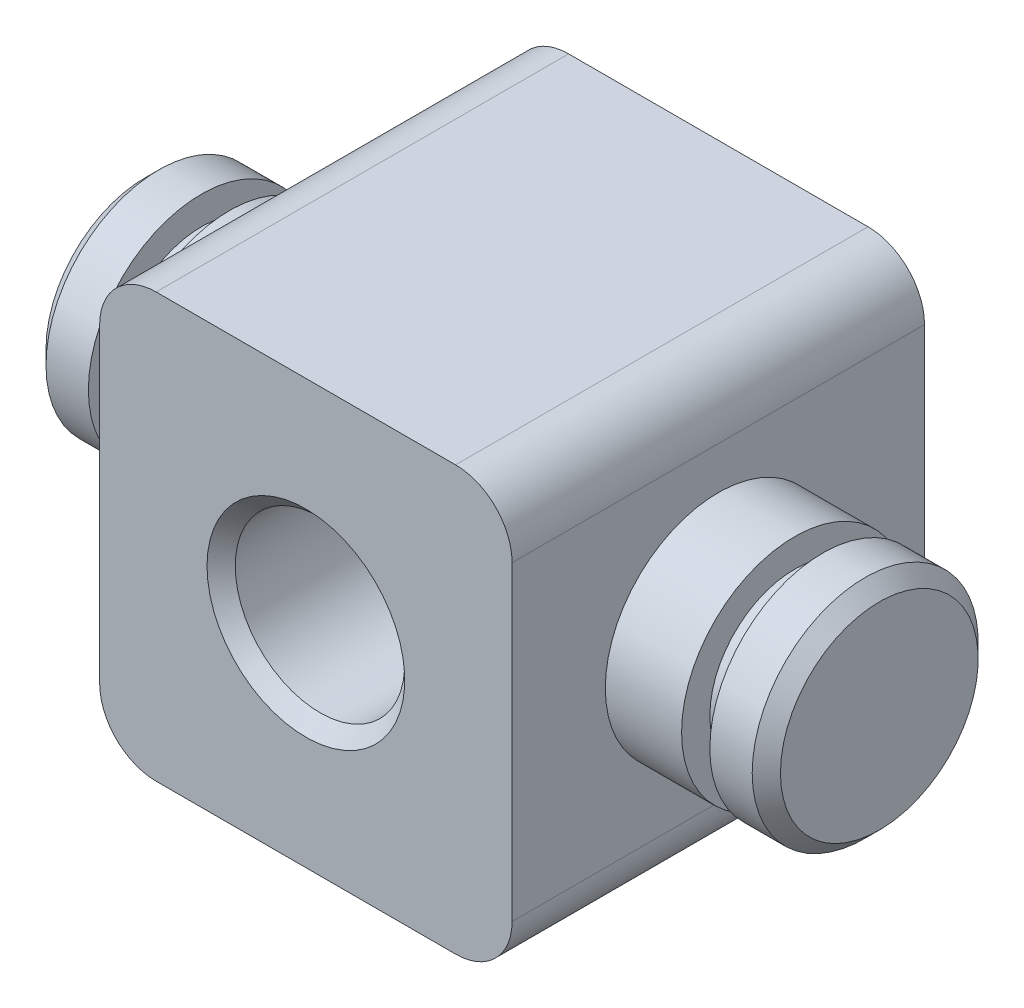
ISO-10303-21;
HEADER;
FILE_DESCRIPTION(('STEP AP214'),'2;1');
FILE_NAME('part.step','',(''),(''),'','','');
FILE_SCHEMA(('AUTOMOTIVE_DESIGN { 1 0 10303 214 1 1 1 1 }'));
ENDSEC;
DATA;
#1=APPLICATION_CONTEXT('core data for automotive mechanical design processes');
#2=APPLICATION_PROTOCOL_DEFINITION('international standard','automotive_design',2000,#1);
#3=PRODUCT_CONTEXT('',#1,'mechanical');
#4=PRODUCT('Part','Part','',(#3));
#5=PRODUCT_RELATED_PRODUCT_CATEGORY('part','',(#4));
#6=PRODUCT_DEFINITION_FORMATION('','',#4);
#7=PRODUCT_DEFINITION_CONTEXT('part definition',#1,'design');
#8=PRODUCT_DEFINITION('design','',#6,#7);
#9=PRODUCT_DEFINITION_SHAPE('','',#8);
#10=(LENGTH_UNIT() NAMED_UNIT(*) SI_UNIT(.MILLI.,.METRE.));
#11=(NAMED_UNIT(*) PLANE_ANGLE_UNIT() SI_UNIT($,.RADIAN.));
#12=(NAMED_UNIT(*) SI_UNIT($,.STERADIAN.) SOLID_ANGLE_UNIT());
#13=UNCERTAINTY_MEASURE_WITH_UNIT(LENGTH_MEASURE(1.E-05),#10,'distance_accuracy_value','');
#14=(GEOMETRIC_REPRESENTATION_CONTEXT(3) GLOBAL_UNCERTAINTY_ASSIGNED_CONTEXT((#13)) GLOBAL_UNIT_ASSIGNED_CONTEXT((#10,
#11,#12)) REPRESENTATION_CONTEXT('',''));
#15=CARTESIAN_POINT('',(0.,0.,0.));
#16=DIRECTION('',(0.,0.,1.));
#17=DIRECTION('',(1.,0.,0.));
#18=AXIS2_PLACEMENT_3D('',#15,#16,#17);
#19=CARTESIAN_POINT('',(5.3,5.5,7.3));
#20=DIRECTION('',(0.,0.,-1.));
#21=DIRECTION('',(-1.,0.,0.));
#22=AXIS2_PLACEMENT_3D('',#19,#20,#21);
#23=PLANE('',#22);
#24=CARTESIAN_POINT('',(0.,0.,7.3));
#25=DIRECTION('',(0.,0.,-1.));
#26=DIRECTION('',(-1.,0.,0.));
#27=AXIS2_PLACEMENT_3D('',#24,#25,#26);
#28=CIRCLE('',#27,3.5);
#29=CARTESIAN_POINT('',(-3.5,0.,7.3));
#30=VERTEX_POINT('',#29);
#31=EDGE_CURVE('E11',#30,#30,#28,.T.);
#32=ORIENTED_EDGE('',*,*,#31,.T.);
#33=EDGE_LOOP('',(#32));
#34=FACE_BOUND('',#33,.T.);
#35=CARTESIAN_POINT('',(5.3,5.5,7.3));
#36=DIRECTION('',(0.,0.,1.));
#37=DIRECTION('',(-1.,0.,0.));
#38=AXIS2_PLACEMENT_3D('',#35,#36,#37);
#39=CIRCLE('',#38,2.);
#40=CARTESIAN_POINT('',(7.3,5.5,7.3));
#41=VERTEX_POINT('',#40);
#42=CARTESIAN_POINT('',(5.3,7.5,7.3));
#43=VERTEX_POINT('',#42);
#44=EDGE_CURVE('E173',#41,#43,#39,.T.);
#45=ORIENTED_EDGE('',*,*,#44,.T.);
#46=DIRECTION('',(-1.,0.,0.));
#47=VECTOR('',#46,1.);
#48=CARTESIAN_POINT('',(-5.3,7.5,7.3));
#49=LINE('',#48,#47);
#50=CARTESIAN_POINT('',(-5.3,7.5,7.3));
#51=VERTEX_POINT('',#50);
#52=EDGE_CURVE('E110',#43,#51,#49,.T.);
#53=ORIENTED_EDGE('',*,*,#52,.T.);
#54=CARTESIAN_POINT('',(-5.3,5.5,7.3));
#55=DIRECTION('',(0.,0.,1.));
#56=DIRECTION('',(1.,0.,0.));
#57=AXIS2_PLACEMENT_3D('',#54,#55,#56);
#58=CIRCLE('',#57,2.);
#59=CARTESIAN_POINT('',(-7.3,5.5,7.3));
#60=VERTEX_POINT('',#59);
#61=EDGE_CURVE('E361',#51,#60,#58,.T.);
#62=ORIENTED_EDGE('',*,*,#61,.T.);
#63=DIRECTION('',(0.,-1.,0.));
#64=VECTOR('',#63,1.);
#65=CARTESIAN_POINT('',(-7.3,5.5,7.3));
#66=LINE('',#65,#64);
#67=CARTESIAN_POINT('',(-7.3,-5.5,7.3));
#68=VERTEX_POINT('',#67);
#69=EDGE_CURVE('E364',#60,#68,#66,.T.);
#70=ORIENTED_EDGE('',*,*,#69,.T.);
#71=CARTESIAN_POINT('',(-5.3,-5.5,7.3));
#72=DIRECTION('',(0.,0.,1.));
#73=DIRECTION('',(1.,0.,0.));
#74=AXIS2_PLACEMENT_3D('',#71,#72,#73);
#75=CIRCLE('',#74,2.);
#76=CARTESIAN_POINT('',(-5.3,-7.5,7.3));
#77=VERTEX_POINT('',#76);
#78=EDGE_CURVE('E128',#68,#77,#75,.T.);
#79=ORIENTED_EDGE('',*,*,#78,.T.);
#80=DIRECTION('',(1.,0.,0.));
#81=VECTOR('',#80,1.);
#82=CARTESIAN_POINT('',(-5.3,-7.5,7.3));
#83=LINE('',#82,#81);
#84=CARTESIAN_POINT('',(5.3,-7.5,7.3));
#85=VERTEX_POINT('',#84);
#86=EDGE_CURVE('E123',#77,#85,#83,.T.);
#87=ORIENTED_EDGE('',*,*,#86,.T.);
#88=CARTESIAN_POINT('',(5.3,-5.5,7.3));
#89=DIRECTION('',(0.,0.,1.));
#90=DIRECTION('',(1.,0.,0.));
#91=AXIS2_PLACEMENT_3D('',#88,#89,#90);
#92=CIRCLE('',#91,2.);
#93=CARTESIAN_POINT('',(7.3,-5.5,7.3));
#94=VERTEX_POINT('',#93);
#95=EDGE_CURVE('E126',#85,#94,#92,.T.);
#96=ORIENTED_EDGE('',*,*,#95,.T.);
#97=DIRECTION('',(0.,1.,0.));
#98=VECTOR('',#97,1.);
#99=CARTESIAN_POINT('',(7.3,5.5,7.3));
#100=LINE('',#99,#98);
#101=EDGE_CURVE('E66',#94,#41,#100,.T.);
#102=ORIENTED_EDGE('',*,*,#101,.T.);
#103=EDGE_LOOP('',(#45,#53,#62,#70,#79,#87,#96,#102));
#104=FACE_BOUND('',#103,.T.);
#105=ADVANCED_FACE('F47',(#34,#104),#23,.F.);
#106=CARTESIAN_POINT('',(5.3,5.5,-7.3));
#107=DIRECTION('',(0.,0.,-1.));
#108=DIRECTION('',(-1.,0.,0.));
#109=AXIS2_PLACEMENT_3D('',#106,#107,#108);
#110=PLANE('',#109);
#111=CARTESIAN_POINT('',(0.,0.,-7.3));
#112=DIRECTION('',(0.,0.,-1.));
#113=DIRECTION('',(-1.,0.,0.));
#114=AXIS2_PLACEMENT_3D('',#111,#112,#113);
#115=CIRCLE('',#114,3.5);
#116=CARTESIAN_POINT('',(-3.5,0.,-7.3));
#117=VERTEX_POINT('',#116);
#118=EDGE_CURVE('E203',#117,#117,#115,.F.);
#119=ORIENTED_EDGE('',*,*,#118,.T.);
#120=EDGE_LOOP('',(#119));
#121=FACE_BOUND('',#120,.T.);
#122=CARTESIAN_POINT('',(5.3,5.5,-7.3));
#123=DIRECTION('',(0.,0.,1.));
#124=DIRECTION('',(-1.,0.,0.));
#125=AXIS2_PLACEMENT_3D('',#122,#123,#124);
#126=CIRCLE('',#125,2.);
#127=CARTESIAN_POINT('',(7.3,5.5,-7.3));
#128=VERTEX_POINT('',#127);
#129=CARTESIAN_POINT('',(5.3,7.5,-7.3));
#130=VERTEX_POINT('',#129);
#131=EDGE_CURVE('E150',#128,#130,#126,.T.);
#132=ORIENTED_EDGE('',*,*,#131,.F.);
#133=DIRECTION('',(0.,1.,0.));
#134=VECTOR('',#133,1.);
#135=CARTESIAN_POINT('',(7.3,5.5,-7.3));
#136=LINE('',#135,#134);
#137=CARTESIAN_POINT('',(7.3,-5.5,-7.3));
#138=VERTEX_POINT('',#137);
#139=EDGE_CURVE('E101',#138,#128,#136,.T.);
#140=ORIENTED_EDGE('',*,*,#139,.F.);
#141=CARTESIAN_POINT('',(5.3,-5.5,-7.3));
#142=DIRECTION('',(0.,0.,1.));
#143=DIRECTION('',(1.,0.,0.));
#144=AXIS2_PLACEMENT_3D('',#141,#142,#143);
#145=CIRCLE('',#144,2.);
#146=CARTESIAN_POINT('',(5.3,-7.5,-7.3));
#147=VERTEX_POINT('',#146);
#148=EDGE_CURVE('E95',#147,#138,#145,.T.);
#149=ORIENTED_EDGE('',*,*,#148,.F.);
#150=DIRECTION('',(1.,0.,0.));
#151=VECTOR('',#150,1.);
#152=CARTESIAN_POINT('',(-5.3,-7.5,-7.3));
#153=LINE('',#152,#151);
#154=CARTESIAN_POINT('',(-5.3,-7.5,-7.3));
#155=VERTEX_POINT('',#154);
#156=EDGE_CURVE('E137',#155,#147,#153,.T.);
#157=ORIENTED_EDGE('',*,*,#156,.F.);
#158=CARTESIAN_POINT('',(-5.3,-5.5,-7.3));
#159=DIRECTION('',(0.,0.,1.));
#160=DIRECTION('',(1.,0.,0.));
#161=AXIS2_PLACEMENT_3D('',#158,#159,#160);
#162=CIRCLE('',#161,2.);
#163=CARTESIAN_POINT('',(-7.3,-5.5,-7.3));
#164=VERTEX_POINT('',#163);
#165=EDGE_CURVE('E164',#164,#155,#162,.T.);
#166=ORIENTED_EDGE('',*,*,#165,.F.);
#167=DIRECTION('',(0.,-1.,0.));
#168=VECTOR('',#167,1.);
#169=CARTESIAN_POINT('',(-7.3,5.5,-7.3));
#170=LINE('',#169,#168);
#171=CARTESIAN_POINT('',(-7.3,5.5,-7.3));
#172=VERTEX_POINT('',#171);
#173=EDGE_CURVE('E161',#172,#164,#170,.T.);
#174=ORIENTED_EDGE('',*,*,#173,.F.);
#175=CARTESIAN_POINT('',(-5.3,5.5,-7.3));
#176=DIRECTION('',(0.,0.,1.));
#177=DIRECTION('',(1.,0.,0.));
#178=AXIS2_PLACEMENT_3D('',#175,#176,#177);
#179=CIRCLE('',#178,2.);
#180=CARTESIAN_POINT('',(-5.3,7.5,-7.3));
#181=VERTEX_POINT('',#180);
#182=EDGE_CURVE('E158',#181,#172,#179,.T.);
#183=ORIENTED_EDGE('',*,*,#182,.F.);
#184=DIRECTION('',(-1.,0.,0.));
#185=VECTOR('',#184,1.);
#186=CARTESIAN_POINT('',(-5.3,7.5,-7.3));
#187=LINE('',#186,#185);
#188=EDGE_CURVE('E154',#130,#181,#187,.T.);
#189=ORIENTED_EDGE('',*,*,#188,.F.);
#190=EDGE_LOOP('',(#132,#140,#149,#157,#166,#174,#183,#189));
#191=FACE_BOUND('',#190,.T.);
#192=ADVANCED_FACE('F223',(#121,#191),#110,.T.);
#193=CARTESIAN_POINT('',(5.3,5.5,7.3));
#194=DIRECTION('',(0.,0.,-1.));
#195=DIRECTION('',(-1.,0.,0.));
#196=AXIS2_PLACEMENT_3D('',#193,#194,#195);
#197=CYLINDRICAL_SURFACE('',#196,2.);
#198=ORIENTED_EDGE('',*,*,#131,.T.);
#199=DIRECTION('',(0.,0.,-1.));
#200=VECTOR('',#199,1.);
#201=CARTESIAN_POINT('',(5.3,7.5,7.3));
#202=LINE('',#201,#200);
#203=EDGE_CURVE('E192',#43,#130,#202,.T.);
#204=ORIENTED_EDGE('',*,*,#203,.F.);
#205=ORIENTED_EDGE('',*,*,#44,.F.);
#206=DIRECTION('',(0.,0.,-1.));
#207=VECTOR('',#206,1.);
#208=CARTESIAN_POINT('',(7.3,5.5,7.3));
#209=LINE('',#208,#207);
#210=EDGE_CURVE('E146',#41,#128,#209,.T.);
#211=ORIENTED_EDGE('',*,*,#210,.T.);
#212=EDGE_LOOP('',(#198,#204,#205,#211));
#213=FACE_BOUND('',#212,.T.);
#214=ADVANCED_FACE('F226',(#213),#197,.T.);
#215=CARTESIAN_POINT('',(-5.3,7.5,7.3));
#216=DIRECTION('',(0.,-1.,0.));
#217=DIRECTION('',(0.,0.,-1.));
#218=AXIS2_PLACEMENT_3D('',#215,#216,#217);
#219=PLANE('',#218);
#220=ORIENTED_EDGE('',*,*,#188,.T.);
#221=DIRECTION('',(0.,0.,-1.));
#222=VECTOR('',#221,1.);
#223=CARTESIAN_POINT('',(-5.3,7.5,7.3));
#224=LINE('',#223,#222);
#225=EDGE_CURVE('E188',#51,#181,#224,.T.);
#226=ORIENTED_EDGE('',*,*,#225,.F.);
#227=ORIENTED_EDGE('',*,*,#52,.F.);
#228=ORIENTED_EDGE('',*,*,#203,.T.);
#229=EDGE_LOOP('',(#220,#226,#227,#228));
#230=FACE_BOUND('',#229,.T.);
#231=ADVANCED_FACE('F379',(#230),#219,.F.);
#232=CARTESIAN_POINT('',(-5.3,5.5,7.3));
#233=DIRECTION('',(0.,0.,-1.));
#234=DIRECTION('',(-1.,0.,0.));
#235=AXIS2_PLACEMENT_3D('',#232,#233,#234);
#236=CYLINDRICAL_SURFACE('',#235,2.);
#237=ORIENTED_EDGE('',*,*,#182,.T.);
#238=DIRECTION('',(0.,0.,-1.));
#239=VECTOR('',#238,1.);
#240=CARTESIAN_POINT('',(-7.3,5.5,7.3));
#241=LINE('',#240,#239);
#242=EDGE_CURVE('E184',#60,#172,#241,.T.);
#243=ORIENTED_EDGE('',*,*,#242,.F.);
#244=ORIENTED_EDGE('',*,*,#61,.F.);
#245=ORIENTED_EDGE('',*,*,#225,.T.);
#246=EDGE_LOOP('',(#237,#243,#244,#245));
#247=FACE_BOUND('',#246,.T.);
#248=ADVANCED_FACE('F378',(#247),#236,.T.);
#249=CARTESIAN_POINT('',(-7.3,5.5,7.3));
#250=DIRECTION('',(1.,0.,0.));
#251=DIRECTION('',(0.,1.,0.));
#252=AXIS2_PLACEMENT_3D('',#249,#250,#251);
#253=PLANE('',#252);
#254=CARTESIAN_POINT('',(-7.3,0.,0.));
#255=DIRECTION('',(1.,0.,0.));
#256=DIRECTION('',(0.,1.,0.));
#257=AXIS2_PLACEMENT_3D('',#254,#255,#256);
#258=CIRCLE('',#257,4.);
#259=CARTESIAN_POINT('',(-7.3,4.,0.));
#260=VERTEX_POINT('',#259);
#261=EDGE_CURVE('E199',#260,#260,#258,.F.);
#262=ORIENTED_EDGE('',*,*,#261,.F.);
#263=EDGE_LOOP('',(#262));
#264=FACE_BOUND('',#263,.T.);
#265=ORIENTED_EDGE('',*,*,#173,.T.);
#266=DIRECTION('',(0.,0.,-1.));
#267=VECTOR('',#266,1.);
#268=CARTESIAN_POINT('',(-7.3,-5.5,7.3));
#269=LINE('',#268,#267);
#270=EDGE_CURVE('E180',#68,#164,#269,.T.);
#271=ORIENTED_EDGE('',*,*,#270,.F.);
#272=ORIENTED_EDGE('',*,*,#69,.F.);
#273=ORIENTED_EDGE('',*,*,#242,.T.);
#274=EDGE_LOOP('',(#265,#271,#272,#273));
#275=FACE_BOUND('',#274,.T.);
#276=ADVANCED_FACE('F372',(#264,#275),#253,.F.);
#277=CARTESIAN_POINT('',(-5.3,-5.5,7.3));
#278=DIRECTION('',(0.,0.,-1.));
#279=DIRECTION('',(-1.,0.,0.));
#280=AXIS2_PLACEMENT_3D('',#277,#278,#279);
#281=CYLINDRICAL_SURFACE('',#280,2.);
#282=ORIENTED_EDGE('',*,*,#165,.T.);
#283=DIRECTION('',(0.,0.,-1.));
#284=VECTOR('',#283,1.);
#285=CARTESIAN_POINT('',(-5.3,-7.5,7.3));
#286=LINE('',#285,#284);
#287=EDGE_CURVE('E139',#77,#155,#286,.T.);
#288=ORIENTED_EDGE('',*,*,#287,.F.);
#289=ORIENTED_EDGE('',*,*,#78,.F.);
#290=ORIENTED_EDGE('',*,*,#270,.T.);
#291=EDGE_LOOP('',(#282,#288,#289,#290));
#292=FACE_BOUND('',#291,.T.);
#293=ADVANCED_FACE('F376',(#292),#281,.T.);
#294=CARTESIAN_POINT('',(-5.3,-7.5,7.3));
#295=DIRECTION('',(0.,1.,0.));
#296=DIRECTION('',(0.,0.,1.));
#297=AXIS2_PLACEMENT_3D('',#294,#295,#296);
#298=PLANE('',#297);
#299=ORIENTED_EDGE('',*,*,#156,.T.);
#300=DIRECTION('',(0.,0.,-1.));
#301=VECTOR('',#300,1.);
#302=CARTESIAN_POINT('',(5.3,-7.5,7.3));
#303=LINE('',#302,#301);
#304=EDGE_CURVE('E134',#85,#147,#303,.T.);
#305=ORIENTED_EDGE('',*,*,#304,.F.);
#306=ORIENTED_EDGE('',*,*,#86,.F.);
#307=ORIENTED_EDGE('',*,*,#287,.T.);
#308=EDGE_LOOP('',(#299,#305,#306,#307));
#309=FACE_BOUND('',#308,.T.);
#310=ADVANCED_FACE('F135',(#309),#298,.F.);
#311=CARTESIAN_POINT('',(5.3,-5.5,7.3));
#312=DIRECTION('',(0.,0.,-1.));
#313=DIRECTION('',(-1.,0.,0.));
#314=AXIS2_PLACEMENT_3D('',#311,#312,#313);
#315=CYLINDRICAL_SURFACE('',#314,2.);
#316=ORIENTED_EDGE('',*,*,#148,.T.);
#317=DIRECTION('',(0.,0.,-1.));
#318=VECTOR('',#317,1.);
#319=CARTESIAN_POINT('',(7.3,-5.5,7.3));
#320=LINE('',#319,#318);
#321=EDGE_CURVE('E140',#94,#138,#320,.T.);
#322=ORIENTED_EDGE('',*,*,#321,.F.);
#323=ORIENTED_EDGE('',*,*,#95,.F.);
#324=ORIENTED_EDGE('',*,*,#304,.T.);
#325=EDGE_LOOP('',(#316,#322,#323,#324));
#326=FACE_BOUND('',#325,.T.);
#327=ADVANCED_FACE('F142',(#326),#315,.T.);
#328=CARTESIAN_POINT('',(7.3,5.5,7.3));
#329=DIRECTION('',(-1.,0.,0.));
#330=DIRECTION('',(0.,-1.,0.));
#331=AXIS2_PLACEMENT_3D('',#328,#329,#330);
#332=PLANE('',#331);
#333=CARTESIAN_POINT('',(7.3,0.,0.));
#334=DIRECTION('',(-1.,0.,0.));
#335=DIRECTION('',(0.,-1.,0.));
#336=AXIS2_PLACEMENT_3D('',#333,#334,#335);
#337=CIRCLE('',#336,4.);
#338=CARTESIAN_POINT('',(7.3,-4.,0.));
#339=VERTEX_POINT('',#338);
#340=EDGE_CURVE('E195',#339,#339,#337,.F.);
#341=ORIENTED_EDGE('',*,*,#340,.F.);
#342=EDGE_LOOP('',(#341));
#343=FACE_BOUND('',#342,.T.);
#344=ORIENTED_EDGE('',*,*,#139,.T.);
#345=ORIENTED_EDGE('',*,*,#210,.F.);
#346=ORIENTED_EDGE('',*,*,#101,.F.);
#347=ORIENTED_EDGE('',*,*,#321,.T.);
#348=EDGE_LOOP('',(#344,#345,#346,#347));
#349=FACE_BOUND('',#348,.T.);
#350=ADVANCED_FACE('F233',(#343,#349),#332,.F.);
#351=CARTESIAN_POINT('',(0.,0.,7.3));
#352=DIRECTION('',(0.,0.,-1.));
#353=DIRECTION('',(-1.,0.,0.));
#354=AXIS2_PLACEMENT_3D('',#351,#352,#353);
#355=CYLINDRICAL_SURFACE('',#354,3.);
#356=CARTESIAN_POINT('',(0.,0.,-6.8));
#357=DIRECTION('',(0.,0.,-1.));
#358=DIRECTION('',(-1.,0.,0.));
#359=AXIS2_PLACEMENT_3D('',#356,#357,#358);
#360=CIRCLE('',#359,3.);
#361=CARTESIAN_POINT('',(-3.,0.,-6.8));
#362=VERTEX_POINT('',#361);
#363=EDGE_CURVE('E58',#362,#362,#360,.T.);
#364=ORIENTED_EDGE('',*,*,#363,.T.);
#365=EDGE_LOOP('',(#364));
#366=FACE_BOUND('',#365,.T.);
#367=CARTESIAN_POINT('',(0.,0.,6.8));
#368=DIRECTION('',(0.,0.,-1.));
#369=DIRECTION('',(-1.,0.,0.));
#370=AXIS2_PLACEMENT_3D('',#367,#368,#369);
#371=CIRCLE('',#370,3.);
#372=CARTESIAN_POINT('',(-3.,0.,6.8));
#373=VERTEX_POINT('',#372);
#374=EDGE_CURVE('E207',#373,#373,#371,.F.);
#375=ORIENTED_EDGE('',*,*,#374,.T.);
#376=EDGE_LOOP('',(#375));
#377=FACE_BOUND('',#376,.T.);
#378=ADVANCED_FACE('F214',(#366,#377),#355,.F.);
#379=CARTESIAN_POINT('',(-27.281048221811,0.,0.));
#380=DIRECTION('',(-1.,0.,0.));
#381=DIRECTION('',(0.,0.,1.));
#382=AXIS2_PLACEMENT_3D('',#379,#380,#381);
#383=CYLINDRICAL_SURFACE('',#382,4.);
#384=ORIENTED_EDGE('',*,*,#340,.T.);
#385=EDGE_LOOP('',(#384));
#386=FACE_BOUND('',#385,.T.);
#387=CARTESIAN_POINT('',(10.,0.,0.));
#388=DIRECTION('',(-1.,0.,0.));
#389=DIRECTION('',(0.,0.,1.));
#390=AXIS2_PLACEMENT_3D('',#387,#388,#389);
#391=CIRCLE('',#390,4.);
#392=CARTESIAN_POINT('',(10.,0.,4.));
#393=VERTEX_POINT('',#392);
#394=EDGE_CURVE('E155',#393,#393,#391,.T.);
#395=ORIENTED_EDGE('',*,*,#394,.T.);
#396=EDGE_LOOP('',(#395));
#397=FACE_BOUND('',#396,.T.);
#398=ADVANCED_FACE('F242',(#386,#397),#383,.T.);
#399=CARTESIAN_POINT('',(10.,4.,0.));
#400=DIRECTION('',(-1.,0.,0.));
#401=DIRECTION('',(0.,0.,1.));
#402=AXIS2_PLACEMENT_3D('',#399,#400,#401);
#403=PLANE('',#402);
#404=ORIENTED_EDGE('',*,*,#394,.F.);
#405=EDGE_LOOP('',(#404));
#406=FACE_BOUND('',#405,.T.);
#407=CARTESIAN_POINT('',(10.,0.,0.));
#408=DIRECTION('',(-1.,0.,0.));
#409=DIRECTION('',(0.,0.,1.));
#410=AXIS2_PLACEMENT_3D('',#407,#408,#409);
#411=CIRCLE('',#410,3.);
#412=CARTESIAN_POINT('',(10.,0.,3.));
#413=VERTEX_POINT('',#412);
#414=EDGE_CURVE('E331',#413,#413,#411,.T.);
#415=ORIENTED_EDGE('',*,*,#414,.T.);
#416=EDGE_LOOP('',(#415));
#417=FACE_BOUND('',#416,.T.);
#418=ADVANCED_FACE('F282',(#406,#417),#403,.F.);
#419=CARTESIAN_POINT('',(-27.281048221811,0.,0.));
#420=DIRECTION('',(-1.,0.,0.));
#421=DIRECTION('',(0.,0.,1.));
#422=AXIS2_PLACEMENT_3D('',#419,#420,#421);
#423=CYLINDRICAL_SURFACE('',#422,3.);
#424=ORIENTED_EDGE('',*,*,#414,.F.);
#425=EDGE_LOOP('',(#424));
#426=FACE_BOUND('',#425,.T.);
#427=CARTESIAN_POINT('',(11.,0.,0.));
#428=DIRECTION('',(-1.,0.,0.));
#429=DIRECTION('',(0.,0.,1.));
#430=AXIS2_PLACEMENT_3D('',#427,#428,#429);
#431=CIRCLE('',#430,3.);
#432=CARTESIAN_POINT('',(11.,0.,3.));
#433=VERTEX_POINT('',#432);
#434=EDGE_CURVE('E327',#433,#433,#431,.T.);
#435=ORIENTED_EDGE('',*,*,#434,.T.);
#436=EDGE_LOOP('',(#435));
#437=FACE_BOUND('',#436,.T.);
#438=ADVANCED_FACE('F286',(#426,#437),#423,.T.);
#439=CARTESIAN_POINT('',(11.,3.,0.));
#440=DIRECTION('',(1.,0.,0.));
#441=DIRECTION('',(0.,0.,-1.));
#442=AXIS2_PLACEMENT_3D('',#439,#440,#441);
#443=PLANE('',#442);
#444=ORIENTED_EDGE('',*,*,#434,.F.);
#445=EDGE_LOOP('',(#444));
#446=FACE_BOUND('',#445,.T.);
#447=CARTESIAN_POINT('',(11.,0.,0.));
#448=DIRECTION('',(-1.,0.,0.));
#449=DIRECTION('',(0.,0.,1.));
#450=AXIS2_PLACEMENT_3D('',#447,#448,#449);
#451=CIRCLE('',#450,4.);
#452=CARTESIAN_POINT('',(11.,0.,4.));
#453=VERTEX_POINT('',#452);
#454=EDGE_CURVE('E318',#453,#453,#451,.T.);
#455=ORIENTED_EDGE('',*,*,#454,.T.);
#456=EDGE_LOOP('',(#455));
#457=FACE_BOUND('',#456,.T.);
#458=ADVANCED_FACE('F290',(#446,#457),#443,.F.);
#459=CARTESIAN_POINT('',(-27.281048221811,0.,0.));
#460=DIRECTION('',(-1.,0.,0.));
#461=DIRECTION('',(0.,0.,1.));
#462=AXIS2_PLACEMENT_3D('',#459,#460,#461);
#463=CYLINDRICAL_SURFACE('',#462,4.);
#464=ORIENTED_EDGE('',*,*,#454,.F.);
#465=EDGE_LOOP('',(#464));
#466=FACE_BOUND('',#465,.T.);
#467=CARTESIAN_POINT('',(12.5,0.,0.));
#468=DIRECTION('',(-1.,0.,0.));
#469=DIRECTION('',(0.,0.,1.));
#470=AXIS2_PLACEMENT_3D('',#467,#468,#469);
#471=CIRCLE('',#470,4.);
#472=CARTESIAN_POINT('',(12.5,0.,4.));
#473=VERTEX_POINT('',#472);
#474=EDGE_CURVE('E312',#473,#473,#471,.T.);
#475=ORIENTED_EDGE('',*,*,#474,.T.);
#476=EDGE_LOOP('',(#475));
#477=FACE_BOUND('',#476,.T.);
#478=ADVANCED_FACE('F294',(#466,#477),#463,.T.);
#479=CARTESIAN_POINT('',(13.,0.,0.));
#480=DIRECTION('',(-1.,0.,0.));
#481=DIRECTION('',(0.,0.,1.));
#482=AXIS2_PLACEMENT_3D('',#479,#480,#481);
#483=CONICAL_SURFACE('',#482,3.5,0.785398163397447);
#484=ORIENTED_EDGE('',*,*,#474,.F.);
#485=EDGE_LOOP('',(#484));
#486=FACE_BOUND('',#485,.T.);
#487=CARTESIAN_POINT('',(13.,0.,0.));
#488=DIRECTION('',(-1.,0.,0.));
#489=DIRECTION('',(0.,0.,1.));
#490=AXIS2_PLACEMENT_3D('',#487,#488,#489);
#491=CIRCLE('',#490,3.5);
#492=CARTESIAN_POINT('',(13.,0.,3.5));
#493=VERTEX_POINT('',#492);
#494=EDGE_CURVE('E309',#493,#493,#491,.T.);
#495=ORIENTED_EDGE('',*,*,#494,.T.);
#496=EDGE_LOOP('',(#495));
#497=FACE_BOUND('',#496,.T.);
#498=ADVANCED_FACE('F298',(#486,#497),#483,.T.);
#499=CARTESIAN_POINT('',(13.,3.5,0.));
#500=DIRECTION('',(-1.,0.,0.));
#501=DIRECTION('',(0.,0.,1.));
#502=AXIS2_PLACEMENT_3D('',#499,#500,#501);
#503=PLANE('',#502);
#504=ORIENTED_EDGE('',*,*,#494,.F.);
#505=EDGE_LOOP('',(#504));
#506=FACE_BOUND('',#505,.T.);
#507=ADVANCED_FACE('F258',(#506),#503,.F.);
#508=CARTESIAN_POINT('',(-27.281048221811,0.,0.));
#509=DIRECTION('',(-1.,0.,0.));
#510=DIRECTION('',(0.,0.,1.));
#511=AXIS2_PLACEMENT_3D('',#508,#509,#510);
#512=CYLINDRICAL_SURFACE('',#511,4.);
#513=CARTESIAN_POINT('',(-12.5,0.,0.));
#514=DIRECTION('',(-1.,0.,0.));
#515=DIRECTION('',(0.,0.,1.));
#516=AXIS2_PLACEMENT_3D('',#513,#514,#515);
#517=CIRCLE('',#516,4.);
#518=CARTESIAN_POINT('',(-12.5,0.,4.));
#519=VERTEX_POINT('',#518);
#520=EDGE_CURVE('E313',#519,#519,#517,.T.);
#521=ORIENTED_EDGE('',*,*,#520,.F.);
#522=EDGE_LOOP('',(#521));
#523=FACE_BOUND('',#522,.T.);
#524=CARTESIAN_POINT('',(-11.,0.,0.));
#525=DIRECTION('',(-1.,0.,0.));
#526=DIRECTION('',(0.,0.,1.));
#527=AXIS2_PLACEMENT_3D('',#524,#525,#526);
#528=CIRCLE('',#527,4.);
#529=CARTESIAN_POINT('',(-11.,0.,4.));
#530=VERTEX_POINT('',#529);
#531=EDGE_CURVE('E338',#530,#530,#528,.T.);
#532=ORIENTED_EDGE('',*,*,#531,.T.);
#533=EDGE_LOOP('',(#532));
#534=FACE_BOUND('',#533,.T.);
#535=ADVANCED_FACE('F254',(#523,#534),#512,.T.);
#536=CARTESIAN_POINT('',(-12.5,0.,0.));
#537=DIRECTION('',(1.,0.,0.));
#538=DIRECTION('',(0.,0.,-1.));
#539=AXIS2_PLACEMENT_3D('',#536,#537,#538);
#540=CONICAL_SURFACE('',#539,4.,0.785398163397447);
#541=CARTESIAN_POINT('',(-13.,0.,0.));
#542=DIRECTION('',(-1.,0.,0.));
#543=DIRECTION('',(0.,0.,1.));
#544=AXIS2_PLACEMENT_3D('',#541,#542,#543);
#545=CIRCLE('',#544,3.5);
#546=CARTESIAN_POINT('',(-13.,0.,3.5));
#547=VERTEX_POINT('',#546);
#548=EDGE_CURVE('E321',#547,#547,#545,.T.);
#549=ORIENTED_EDGE('',*,*,#548,.F.);
#550=EDGE_LOOP('',(#549));
#551=FACE_BOUND('',#550,.T.);
#552=ORIENTED_EDGE('',*,*,#520,.T.);
#553=EDGE_LOOP('',(#552));
#554=FACE_BOUND('',#553,.T.);
#555=ADVANCED_FACE('F257',(#551,#554),#540,.T.);
#556=CARTESIAN_POINT('',(-13.,3.5,0.));
#557=DIRECTION('',(1.,0.,0.));
#558=DIRECTION('',(0.,0.,-1.));
#559=AXIS2_PLACEMENT_3D('',#556,#557,#558);
#560=PLANE('',#559);
#561=ORIENTED_EDGE('',*,*,#548,.T.);
#562=EDGE_LOOP('',(#561));
#563=FACE_BOUND('',#562,.T.);
#564=ADVANCED_FACE('F262',(#563),#560,.F.);
#565=CARTESIAN_POINT('',(-27.281048221811,0.,0.));
#566=DIRECTION('',(-1.,0.,0.));
#567=DIRECTION('',(0.,0.,1.));
#568=AXIS2_PLACEMENT_3D('',#565,#566,#567);
#569=CYLINDRICAL_SURFACE('',#568,4.);
#570=CARTESIAN_POINT('',(-10.,0.,0.));
#571=DIRECTION('',(-1.,0.,0.));
#572=DIRECTION('',(0.,0.,1.));
#573=AXIS2_PLACEMENT_3D('',#570,#571,#572);
#574=CIRCLE('',#573,4.);
#575=CARTESIAN_POINT('',(-10.,0.,4.));
#576=VERTEX_POINT('',#575);
#577=EDGE_CURVE('E350',#576,#576,#574,.T.);
#578=ORIENTED_EDGE('',*,*,#577,.F.);
#579=EDGE_LOOP('',(#578));
#580=FACE_BOUND('',#579,.T.);
#581=ORIENTED_EDGE('',*,*,#261,.T.);
#582=EDGE_LOOP('',(#581));
#583=FACE_BOUND('',#582,.T.);
#584=ADVANCED_FACE('F266',(#580,#583),#569,.T.);
#585=CARTESIAN_POINT('',(-10.,4.,0.));
#586=DIRECTION('',(1.,0.,0.));
#587=DIRECTION('',(0.,0.,-1.));
#588=AXIS2_PLACEMENT_3D('',#585,#586,#587);
#589=PLANE('',#588);
#590=CARTESIAN_POINT('',(-10.,0.,0.));
#591=DIRECTION('',(-1.,0.,0.));
#592=DIRECTION('',(0.,0.,1.));
#593=AXIS2_PLACEMENT_3D('',#590,#591,#592);
#594=CIRCLE('',#593,3.);
#595=CARTESIAN_POINT('',(-10.,0.,3.));
#596=VERTEX_POINT('',#595);
#597=EDGE_CURVE('E346',#596,#596,#594,.T.);
#598=ORIENTED_EDGE('',*,*,#597,.F.);
#599=EDGE_LOOP('',(#598));
#600=FACE_BOUND('',#599,.T.);
#601=ORIENTED_EDGE('',*,*,#577,.T.);
#602=EDGE_LOOP('',(#601));
#603=FACE_BOUND('',#602,.T.);
#604=ADVANCED_FACE('F270',(#600,#603),#589,.F.);
#605=CARTESIAN_POINT('',(-27.281048221811,0.,0.));
#606=DIRECTION('',(-1.,0.,0.));
#607=DIRECTION('',(0.,0.,1.));
#608=AXIS2_PLACEMENT_3D('',#605,#606,#607);
#609=CYLINDRICAL_SURFACE('',#608,3.);
#610=CARTESIAN_POINT('',(-11.,0.,0.));
#611=DIRECTION('',(-1.,0.,0.));
#612=DIRECTION('',(0.,0.,1.));
#613=AXIS2_PLACEMENT_3D('',#610,#611,#612);
#614=CIRCLE('',#613,3.);
#615=CARTESIAN_POINT('',(-11.,0.,3.));
#616=VERTEX_POINT('',#615);
#617=EDGE_CURVE('E342',#616,#616,#614,.T.);
#618=ORIENTED_EDGE('',*,*,#617,.F.);
#619=EDGE_LOOP('',(#618));
#620=FACE_BOUND('',#619,.T.);
#621=ORIENTED_EDGE('',*,*,#597,.T.);
#622=EDGE_LOOP('',(#621));
#623=FACE_BOUND('',#622,.T.);
#624=ADVANCED_FACE('F274',(#620,#623),#609,.T.);
#625=CARTESIAN_POINT('',(-11.,3.,0.));
#626=DIRECTION('',(-1.,0.,0.));
#627=DIRECTION('',(0.,0.,1.));
#628=AXIS2_PLACEMENT_3D('',#625,#626,#627);
#629=PLANE('',#628);
#630=ORIENTED_EDGE('',*,*,#531,.F.);
#631=EDGE_LOOP('',(#630));
#632=FACE_BOUND('',#631,.T.);
#633=ORIENTED_EDGE('',*,*,#617,.T.);
#634=EDGE_LOOP('',(#633));
#635=FACE_BOUND('',#634,.T.);
#636=ADVANCED_FACE('F220',(#632,#635),#629,.F.);
#637=CARTESIAN_POINT('',(0.,0.,-7.3));
#638=DIRECTION('',(0.,0.,-1.));
#639=DIRECTION('',(-1.,0.,0.));
#640=AXIS2_PLACEMENT_3D('',#637,#638,#639);
#641=CONICAL_SURFACE('',#640,3.5,0.785398163397449);
#642=ORIENTED_EDGE('',*,*,#363,.F.);
#643=EDGE_LOOP('',(#642));
#644=FACE_BOUND('',#643,.T.);
#645=ORIENTED_EDGE('',*,*,#118,.F.);
#646=EDGE_LOOP('',(#645));
#647=FACE_BOUND('',#646,.T.);
#648=ADVANCED_FACE('F217',(#644,#647),#641,.F.);
#649=CARTESIAN_POINT('',(0.,0.,6.8));
#650=DIRECTION('',(0.,0.,1.));
#651=DIRECTION('',(1.,0.,0.));
#652=AXIS2_PLACEMENT_3D('',#649,#650,#651);
#653=CONICAL_SURFACE('',#652,3.,0.785398163397452);
#654=ORIENTED_EDGE('',*,*,#31,.F.);
#655=EDGE_LOOP('',(#654));
#656=FACE_BOUND('',#655,.T.);
#657=ORIENTED_EDGE('',*,*,#374,.F.);
#658=EDGE_LOOP('',(#657));
#659=FACE_BOUND('',#658,.T.);
#660=ADVANCED_FACE('F50',(#656,#659),#653,.F.);
#661=CLOSED_SHELL('',(#105,#192,#214,#231,#248,#276,#293,#310,#327,#350,#378,#398,#418,#438,
#458,#478,#498,#507,#535,#555,#564,#584,#604,#624,#636,#648,#660));
#662=MANIFOLD_SOLID_BREP('B2',#661);
#663=ADVANCED_BREP_SHAPE_REPRESENTATION('',(#18,#662),#14);
#664=SHAPE_DEFINITION_REPRESENTATION(#9,#663);
ENDSEC;
END-ISO-10303-21;
